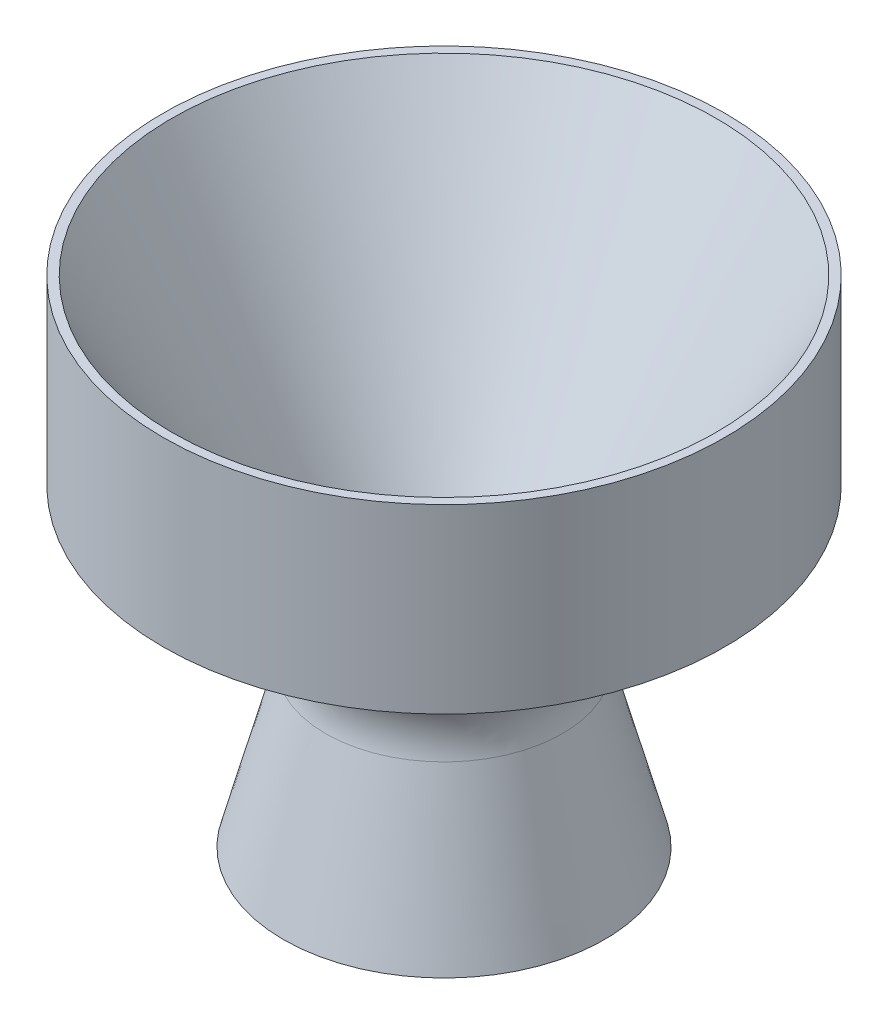
ISO-10303-21;
HEADER;
FILE_DESCRIPTION(('STEP AP214'),'2;1');
FILE_NAME('part.step','',(''),(''),'','','');
FILE_SCHEMA(('AUTOMOTIVE_DESIGN { 1 0 10303 214 1 1 1 1 }'));
ENDSEC;
DATA;
#1=APPLICATION_CONTEXT('core data for automotive mechanical design processes');
#2=APPLICATION_PROTOCOL_DEFINITION('international standard','automotive_design',2000,#1);
#3=PRODUCT_CONTEXT('',#1,'mechanical');
#4=PRODUCT('Part','Part','',(#3));
#5=PRODUCT_RELATED_PRODUCT_CATEGORY('part','',(#4));
#6=PRODUCT_DEFINITION_FORMATION('','',#4);
#7=PRODUCT_DEFINITION_CONTEXT('part definition',#1,'design');
#8=PRODUCT_DEFINITION('design','',#6,#7);
#9=PRODUCT_DEFINITION_SHAPE('','',#8);
#10=(LENGTH_UNIT() NAMED_UNIT(*) SI_UNIT(.MILLI.,.METRE.));
#11=(NAMED_UNIT(*) PLANE_ANGLE_UNIT() SI_UNIT($,.RADIAN.));
#12=(NAMED_UNIT(*) SI_UNIT($,.STERADIAN.) SOLID_ANGLE_UNIT());
#13=UNCERTAINTY_MEASURE_WITH_UNIT(LENGTH_MEASURE(1.E-05),#10,'distance_accuracy_value','');
#14=(GEOMETRIC_REPRESENTATION_CONTEXT(3) GLOBAL_UNCERTAINTY_ASSIGNED_CONTEXT((#13)) GLOBAL_UNIT_ASSIGNED_CONTEXT((#10,
#11,#12)) REPRESENTATION_CONTEXT('',''));
#15=CARTESIAN_POINT('',(0.,0.,0.));
#16=DIRECTION('',(0.,0.,1.));
#17=DIRECTION('',(1.,0.,0.));
#18=AXIS2_PLACEMENT_3D('',#15,#16,#17);
#19=CARTESIAN_POINT('',(38.71,42.2572684477794,0.));
#20=DIRECTION('',(0.,-1.,0.));
#21=DIRECTION('',(0.,0.,-1.));
#22=AXIS2_PLACEMENT_3D('',#19,#20,#21);
#23=PLANE('',#22);
#24=CARTESIAN_POINT('',(0.,42.2572684477794,0.));
#25=DIRECTION('',(0.,1.,0.));
#26=DIRECTION('',(0.,0.,1.));
#27=AXIS2_PLACEMENT_3D('',#24,#25,#26);
#28=CIRCLE('',#27,37.5);
#29=CARTESIAN_POINT('',(0.,42.2572684477794,37.5));
#30=VERTEX_POINT('',#29);
#31=EDGE_CURVE('E59',#30,#30,#28,.T.);
#32=ORIENTED_EDGE('',*,*,#31,.F.);
#33=EDGE_LOOP('',(#32));
#34=FACE_BOUND('',#33,.T.);
#35=CARTESIAN_POINT('',(0.,42.2572684477794,0.));
#36=DIRECTION('',(0.,1.,0.));
#37=DIRECTION('',(0.,0.,1.));
#38=AXIS2_PLACEMENT_3D('',#35,#36,#37);
#39=CIRCLE('',#38,38.71);
#40=CARTESIAN_POINT('',(0.,42.2572684477794,38.71));
#41=VERTEX_POINT('',#40);
#42=EDGE_CURVE('E77',#41,#41,#39,.T.);
#43=ORIENTED_EDGE('',*,*,#42,.T.);
#44=EDGE_LOOP('',(#43));
#45=FACE_BOUND('',#44,.T.);
#46=ADVANCED_FACE('F39',(#34,#45),#23,.F.);
#47=CARTESIAN_POINT('',(0.,42.2572684477794,0.));
#48=DIRECTION('',(0.,1.,0.));
#49=DIRECTION('',(0.,0.,1.));
#50=AXIS2_PLACEMENT_3D('',#47,#48,#49);
#51=CONICAL_SURFACE('',#50,37.5,0.5235987755983);
#52=CARTESIAN_POINT('',(0.,0.316987298107754,0.));
#53=DIRECTION('',(0.,1.,0.));
#54=DIRECTION('',(0.,0.,1.));
#55=AXIS2_PLACEMENT_3D('',#52,#53,#54);
#56=CIRCLE('',#55,13.2857673883485);
#57=CARTESIAN_POINT('',(0.,0.316987298107754,13.2857673883485));
#58=VERTEX_POINT('',#57);
#59=EDGE_CURVE('E62',#58,#58,#56,.T.);
#60=ORIENTED_EDGE('',*,*,#59,.F.);
#61=EDGE_LOOP('',(#60));
#62=FACE_BOUND('',#61,.T.);
#63=ORIENTED_EDGE('',*,*,#31,.T.);
#64=EDGE_LOOP('',(#63));
#65=FACE_BOUND('',#64,.T.);
#66=ADVANCED_FACE('F101',(#62,#65),#51,.F.);
#67=CARTESIAN_POINT('',(0.,0.,0.));
#68=DIRECTION('',(0.,1.,0.));
#69=DIRECTION('',(0.,0.,1.));
#70=AXIS2_PLACEMENT_3D('',#67,#68,#69);
#71=CYLINDRICAL_SURFACE('',#70,13.2857673883485);
#72=CARTESIAN_POINT('',(0.,-0.683012701892246,0.));
#73=DIRECTION('',(0.,1.,0.));
#74=DIRECTION('',(0.,0.,1.));
#75=AXIS2_PLACEMENT_3D('',#72,#73,#74);
#76=CIRCLE('',#75,13.2857673883485);
#77=CARTESIAN_POINT('',(0.,-0.683012701892246,13.2857673883485));
#78=VERTEX_POINT('',#77);
#79=EDGE_CURVE('E65',#78,#78,#76,.T.);
#80=ORIENTED_EDGE('',*,*,#79,.F.);
#81=EDGE_LOOP('',(#80));
#82=FACE_BOUND('',#81,.T.);
#83=ORIENTED_EDGE('',*,*,#59,.T.);
#84=EDGE_LOOP('',(#83));
#85=FACE_BOUND('',#84,.T.);
#86=ADVANCED_FACE('F107',(#82,#85),#71,.F.);
#87=CARTESIAN_POINT('',(0.,-0.683012701892246,0.));
#88=DIRECTION('',(0.,-1.,0.));
#89=DIRECTION('',(0.,0.,-1.));
#90=AXIS2_PLACEMENT_3D('',#87,#88,#89);
#91=CONICAL_SURFACE('',#90,13.2857673883485,0.261799387799151);
#92=CARTESIAN_POINT('',(0.,-25.9627315522206,0.));
#93=DIRECTION('',(0.,1.,0.));
#94=DIRECTION('',(0.,0.,1.));
#95=AXIS2_PLACEMENT_3D('',#92,#93,#94);
#96=CIRCLE('',#95,20.0594476391798);
#97=CARTESIAN_POINT('',(0.,-25.9627315522206,20.0594476391798));
#98=VERTEX_POINT('',#97);
#99=EDGE_CURVE('E68',#98,#98,#96,.T.);
#100=ORIENTED_EDGE('',*,*,#99,.F.);
#101=EDGE_LOOP('',(#100));
#102=FACE_BOUND('',#101,.T.);
#103=ORIENTED_EDGE('',*,*,#79,.T.);
#104=EDGE_LOOP('',(#103));
#105=FACE_BOUND('',#104,.T.);
#106=ADVANCED_FACE('F163',(#102,#105),#91,.F.);
#107=CARTESIAN_POINT('',(20.0594476391798,-25.9627315522206,0.));
#108=DIRECTION('',(0.,1.,0.));
#109=DIRECTION('',(0.,0.,1.));
#110=AXIS2_PLACEMENT_3D('',#107,#108,#109);
#111=PLANE('',#110);
#112=CARTESIAN_POINT('',(0.,-25.9627315522206,0.));
#113=DIRECTION('',(0.,1.,0.));
#114=DIRECTION('',(0.,0.,1.));
#115=AXIS2_PLACEMENT_3D('',#112,#113,#114);
#116=CIRCLE('',#115,22.13);
#117=CARTESIAN_POINT('',(0.,-25.9627315522206,22.13));
#118=VERTEX_POINT('',#117);
#119=EDGE_CURVE('E71',#118,#118,#116,.T.);
#120=ORIENTED_EDGE('',*,*,#119,.F.);
#121=EDGE_LOOP('',(#120));
#122=FACE_BOUND('',#121,.T.);
#123=ORIENTED_EDGE('',*,*,#99,.T.);
#124=EDGE_LOOP('',(#123));
#125=FACE_BOUND('',#124,.T.);
#126=ADVANCED_FACE('F155',(#122,#125),#111,.F.);
#127=CARTESIAN_POINT('',(0.,-25.9627315522206,0.));
#128=DIRECTION('',(0.,-1.,0.));
#129=DIRECTION('',(0.,0.,-1.));
#130=AXIS2_PLACEMENT_3D('',#127,#128,#129);
#131=CONICAL_SURFACE('',#130,22.13,0.261799387799151);
#132=CARTESIAN_POINT('',(0.,-4.28355683973942,0.));
#133=DIRECTION('',(0.,-1.,0.));
#134=DIRECTION('',(0.,0.,-1.));
#135=AXIS2_PLACEMENT_3D('',#132,#133,#134);
#136=CIRCLE('',#135,16.3210826432174);
#137=CARTESIAN_POINT('',(0.,-4.28355683973942,-16.3210826432174));
#138=VERTEX_POINT('',#137);
#139=EDGE_CURVE('E10',#138,#138,#136,.T.);
#140=ORIENTED_EDGE('',*,*,#139,.T.);
#141=EDGE_LOOP('',(#140));
#142=FACE_BOUND('',#141,.T.);
#143=ORIENTED_EDGE('',*,*,#119,.T.);
#144=EDGE_LOOP('',(#143));
#145=FACE_BOUND('',#144,.T.);
#146=ADVANCED_FACE('F98',(#142,#145),#131,.T.);
#147=CARTESIAN_POINT('',(0.,-0.2825610647857,0.));
#148=DIRECTION('',(0.,1.,0.));
#149=DIRECTION('',(0.,0.,1.));
#150=AXIS2_PLACEMENT_3D('',#147,#148,#149);
#151=CONICAL_SURFACE('',#150,15.2490190563982,0.5235987755983);
#152=CARTESIAN_POINT('',(0.,12.2572684477794,0.));
#153=DIRECTION('',(0.,1.,0.));
#154=DIRECTION('',(0.,0.,1.));
#155=AXIS2_PLACEMENT_3D('',#152,#153,#154);
#156=CIRCLE('',#155,22.4888930010697);
#157=CARTESIAN_POINT('',(0.,12.2572684477794,22.4888930010697));
#158=VERTEX_POINT('',#157);
#159=EDGE_CURVE('E46',#158,#158,#156,.F.);
#160=ORIENTED_EDGE('',*,*,#159,.T.);
#161=EDGE_LOOP('',(#160));
#162=FACE_BOUND('',#161,.T.);
#163=CARTESIAN_POINT('',(0.,3.30463361128581,0.));
#164=DIRECTION('',(0.,1.,0.));
#165=DIRECTION('',(0.,0.,1.));
#166=AXIS2_PLACEMENT_3D('',#163,#164,#165);
#167=CIRCLE('',#166,17.3200868682637);
#168=CARTESIAN_POINT('',(0.,3.30463361128581,17.3200868682637));
#169=VERTEX_POINT('',#168);
#170=EDGE_CURVE('E50',#169,#169,#167,.T.);
#171=ORIENTED_EDGE('',*,*,#170,.T.);
#172=EDGE_LOOP('',(#171));
#173=FACE_BOUND('',#172,.T.);
#174=ADVANCED_FACE('F91',(#162,#173),#151,.T.);
#175=CARTESIAN_POINT('',(25.3756443470178,17.2572684477794,0.));
#176=DIRECTION('',(0.,1.,0.));
#177=DIRECTION('',(0.,0.,1.));
#178=AXIS2_PLACEMENT_3D('',#175,#176,#177);
#179=PLANE('',#178);
#180=CARTESIAN_POINT('',(0.,17.2572684477794,0.));
#181=DIRECTION('',(0.,1.,0.));
#182=DIRECTION('',(0.,0.,1.));
#183=AXIS2_PLACEMENT_3D('',#180,#181,#182);
#184=CIRCLE('',#183,31.1491470389141);
#185=CARTESIAN_POINT('',(0.,17.2572684477794,31.1491470389141));
#186=VERTEX_POINT('',#185);
#187=EDGE_CURVE('E54',#186,#186,#184,.T.);
#188=ORIENTED_EDGE('',*,*,#187,.T.);
#189=EDGE_LOOP('',(#188));
#190=FACE_BOUND('',#189,.T.);
#191=CARTESIAN_POINT('',(0.,17.2572684477794,0.));
#192=DIRECTION('',(0.,1.,0.));
#193=DIRECTION('',(0.,0.,1.));
#194=AXIS2_PLACEMENT_3D('',#191,#192,#193);
#195=CIRCLE('',#194,38.71);
#196=CARTESIAN_POINT('',(0.,17.2572684477794,38.71));
#197=VERTEX_POINT('',#196);
#198=EDGE_CURVE('E74',#197,#197,#195,.T.);
#199=ORIENTED_EDGE('',*,*,#198,.F.);
#200=EDGE_LOOP('',(#199));
#201=FACE_BOUND('',#200,.T.);
#202=ADVANCED_FACE('F86',(#190,#201),#179,.F.);
#203=CARTESIAN_POINT('',(0.,0.,0.));
#204=DIRECTION('',(0.,1.,0.));
#205=DIRECTION('',(0.,0.,1.));
#206=AXIS2_PLACEMENT_3D('',#203,#204,#205);
#207=CYLINDRICAL_SURFACE('',#206,38.71);
#208=ORIENTED_EDGE('',*,*,#42,.F.);
#209=EDGE_LOOP('',(#208));
#210=FACE_BOUND('',#209,.T.);
#211=ORIENTED_EDGE('',*,*,#198,.T.);
#212=EDGE_LOOP('',(#211));
#213=FACE_BOUND('',#212,.T.);
#214=ADVANCED_FACE('F82',(#210,#213),#207,.T.);
#215=CARTESIAN_POINT('',(0.,7.25726844777935,0.));
#216=DIRECTION('',(0.,1.,0.));
#217=DIRECTION('',(0.,0.,1.));
#218=AXIS2_PLACEMENT_3D('',#215,#216,#217);
#219=TOROIDAL_SURFACE('',#218,31.1491470389141,10.);
#220=ORIENTED_EDGE('',*,*,#159,.F.);
#221=EDGE_LOOP('',(#220));
#222=FACE_BOUND('',#221,.T.);
#223=ORIENTED_EDGE('',*,*,#187,.F.);
#224=EDGE_LOOP('',(#223));
#225=FACE_BOUND('',#224,.T.);
#226=ADVANCED_FACE('F85',(#222,#225),#219,.F.);
#227=CARTESIAN_POINT('',(0.,-1.6953663887142,0.));
#228=DIRECTION('',(0.,1.,0.));
#229=DIRECTION('',(0.,0.,1.));
#230=AXIS2_PLACEMENT_3D('',#227,#228,#229);
#231=TOROIDAL_SURFACE('',#230,25.9803409061081,10.);
#232=ORIENTED_EDGE('',*,*,#139,.F.);
#233=EDGE_LOOP('',(#232));
#234=FACE_BOUND('',#233,.T.);
#235=ORIENTED_EDGE('',*,*,#170,.F.);
#236=EDGE_LOOP('',(#235));
#237=FACE_BOUND('',#236,.T.);
#238=ADVANCED_FACE('F41',(#234,#237),#231,.F.);
#239=CLOSED_SHELL('',(#46,#66,#86,#106,#126,#146,#174,#202,#214,#226,#238));
#240=MANIFOLD_SOLID_BREP('B2',#239);
#241=ADVANCED_BREP_SHAPE_REPRESENTATION('',(#18,#240),#14);
#242=SHAPE_DEFINITION_REPRESENTATION(#9,#241);
ENDSEC;
END-ISO-10303-21;
